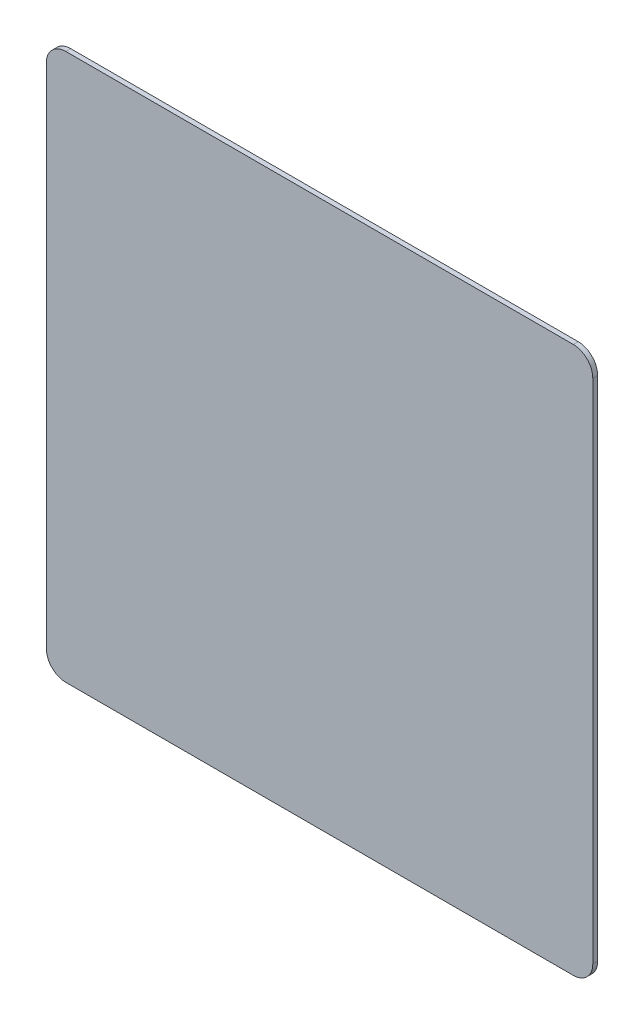
ISO-10303-21;
HEADER;
FILE_DESCRIPTION(('STEP AP214'),'2;1');
FILE_NAME('part.step','',(''),(''),'','','');
FILE_SCHEMA(('AUTOMOTIVE_DESIGN { 1 0 10303 214 1 1 1 1 }'));
ENDSEC;
DATA;
#1=APPLICATION_CONTEXT('core data for automotive mechanical design processes');
#2=APPLICATION_PROTOCOL_DEFINITION('international standard','automotive_design',2000,#1);
#3=PRODUCT_CONTEXT('',#1,'mechanical');
#4=PRODUCT('Part','Part','',(#3));
#5=PRODUCT_RELATED_PRODUCT_CATEGORY('part','',(#4));
#6=PRODUCT_DEFINITION_FORMATION('','',#4);
#7=PRODUCT_DEFINITION_CONTEXT('part definition',#1,'design');
#8=PRODUCT_DEFINITION('design','',#6,#7);
#9=PRODUCT_DEFINITION_SHAPE('','',#8);
#10=(LENGTH_UNIT() NAMED_UNIT(*) SI_UNIT(.MILLI.,.METRE.));
#11=(NAMED_UNIT(*) PLANE_ANGLE_UNIT() SI_UNIT($,.RADIAN.));
#12=(NAMED_UNIT(*) SI_UNIT($,.STERADIAN.) SOLID_ANGLE_UNIT());
#13=UNCERTAINTY_MEASURE_WITH_UNIT(LENGTH_MEASURE(1.E-05),#10,'distance_accuracy_value','');
#14=(GEOMETRIC_REPRESENTATION_CONTEXT(3) GLOBAL_UNCERTAINTY_ASSIGNED_CONTEXT((#13)) GLOBAL_UNIT_ASSIGNED_CONTEXT((#10,
#11,#12)) REPRESENTATION_CONTEXT('',''));
#15=CARTESIAN_POINT('',(0.,0.,0.));
#16=DIRECTION('',(0.,0.,1.));
#17=DIRECTION('',(1.,0.,0.));
#18=AXIS2_PLACEMENT_3D('',#15,#16,#17);
#19=CARTESIAN_POINT('',(-28.,28.,7.5));
#20=DIRECTION('',(1.,0.,0.));
#21=DIRECTION('',(0.,1.,0.));
#22=AXIS2_PLACEMENT_3D('',#19,#20,#21);
#23=PLANE('',#22);
#24=DIRECTION('',(0.,-1.,0.));
#25=VECTOR('',#24,1.);
#26=CARTESIAN_POINT('',(-28.,28.,7.5));
#27=LINE('',#26,#25);
#28=CARTESIAN_POINT('',(-28.,26.,7.5));
#29=VERTEX_POINT('',#28);
#30=CARTESIAN_POINT('',(-28.,-26.,7.5));
#31=VERTEX_POINT('',#30);
#32=EDGE_CURVE('E158',#29,#31,#27,.T.);
#33=ORIENTED_EDGE('',*,*,#32,.F.);
#34=DIRECTION('',(0.,0.,-1.));
#35=VECTOR('',#34,1.);
#36=CARTESIAN_POINT('',(-28.,26.,7.5));
#37=LINE('',#36,#35);
#38=CARTESIAN_POINT('',(-28.,26.,7.));
#39=VERTEX_POINT('',#38);
#40=EDGE_CURVE('E114',#29,#39,#37,.T.);
#41=ORIENTED_EDGE('',*,*,#40,.T.);
#42=DIRECTION('',(0.,-1.,0.));
#43=VECTOR('',#42,1.);
#44=CARTESIAN_POINT('',(-28.,28.,7.));
#45=LINE('',#44,#43);
#46=CARTESIAN_POINT('',(-28.,-26.,7.));
#47=VERTEX_POINT('',#46);
#48=EDGE_CURVE('E109',#39,#47,#45,.T.);
#49=ORIENTED_EDGE('',*,*,#48,.T.);
#50=DIRECTION('',(0.,0.,-1.));
#51=VECTOR('',#50,1.);
#52=CARTESIAN_POINT('',(-28.,-26.,7.5));
#53=LINE('',#52,#51);
#54=EDGE_CURVE('E119',#47,#31,#53,.F.);
#55=ORIENTED_EDGE('',*,*,#54,.T.);
#56=EDGE_LOOP('',(#33,#41,#49,#55));
#57=FACE_BOUND('',#56,.T.);
#58=ADVANCED_FACE('F33',(#57),#23,.F.);
#59=CARTESIAN_POINT('',(-28.,-28.,7.5));
#60=DIRECTION('',(0.,1.,0.));
#61=DIRECTION('',(-1.,0.,0.));
#62=AXIS2_PLACEMENT_3D('',#59,#60,#61);
#63=PLANE('',#62);
#64=DIRECTION('',(1.,0.,0.));
#65=VECTOR('',#64,1.);
#66=CARTESIAN_POINT('',(-28.,-28.,7.5));
#67=LINE('',#66,#65);
#68=CARTESIAN_POINT('',(-26.,-28.,7.5));
#69=VERTEX_POINT('',#68);
#70=CARTESIAN_POINT('',(26.,-28.,7.5));
#71=VERTEX_POINT('',#70);
#72=EDGE_CURVE('E156',#69,#71,#67,.T.);
#73=ORIENTED_EDGE('',*,*,#72,.F.);
#74=DIRECTION('',(0.,0.,-1.));
#75=VECTOR('',#74,1.);
#76=CARTESIAN_POINT('',(-26.,-28.,7.5));
#77=LINE('',#76,#75);
#78=CARTESIAN_POINT('',(-26.,-28.,7.));
#79=VERTEX_POINT('',#78);
#80=EDGE_CURVE('E108',#69,#79,#77,.T.);
#81=ORIENTED_EDGE('',*,*,#80,.T.);
#82=DIRECTION('',(1.,0.,0.));
#83=VECTOR('',#82,1.);
#84=CARTESIAN_POINT('',(-28.,-28.,7.));
#85=LINE('',#84,#83);
#86=CARTESIAN_POINT('',(26.,-28.,7.));
#87=VERTEX_POINT('',#86);
#88=EDGE_CURVE('E98',#79,#87,#85,.T.);
#89=ORIENTED_EDGE('',*,*,#88,.T.);
#90=DIRECTION('',(0.,0.,-1.));
#91=VECTOR('',#90,1.);
#92=CARTESIAN_POINT('',(26.,-28.,7.5));
#93=LINE('',#92,#91);
#94=EDGE_CURVE('E47',#87,#71,#93,.F.);
#95=ORIENTED_EDGE('',*,*,#94,.T.);
#96=EDGE_LOOP('',(#73,#81,#89,#95));
#97=FACE_BOUND('',#96,.T.);
#98=ADVANCED_FACE('F106',(#97),#63,.F.);
#99=CARTESIAN_POINT('',(28.,28.,7.5));
#100=DIRECTION('',(-1.,0.,0.));
#101=DIRECTION('',(0.,-1.,0.));
#102=AXIS2_PLACEMENT_3D('',#99,#100,#101);
#103=PLANE('',#102);
#104=DIRECTION('',(0.,1.,0.));
#105=VECTOR('',#104,1.);
#106=CARTESIAN_POINT('',(28.,28.,7.));
#107=LINE('',#106,#105);
#108=CARTESIAN_POINT('',(28.,-26.,7.));
#109=VERTEX_POINT('',#108);
#110=CARTESIAN_POINT('',(28.,26.,7.));
#111=VERTEX_POINT('',#110);
#112=EDGE_CURVE('E101',#109,#111,#107,.T.);
#113=ORIENTED_EDGE('',*,*,#112,.T.);
#114=DIRECTION('',(0.,0.,-1.));
#115=VECTOR('',#114,1.);
#116=CARTESIAN_POINT('',(28.,26.,7.5));
#117=LINE('',#116,#115);
#118=CARTESIAN_POINT('',(28.,26.,7.5));
#119=VERTEX_POINT('',#118);
#120=EDGE_CURVE('E141',#111,#119,#117,.F.);
#121=ORIENTED_EDGE('',*,*,#120,.T.);
#122=DIRECTION('',(0.,1.,0.));
#123=VECTOR('',#122,1.);
#124=CARTESIAN_POINT('',(28.,28.,7.5));
#125=LINE('',#124,#123);
#126=CARTESIAN_POINT('',(28.,-26.,7.5));
#127=VERTEX_POINT('',#126);
#128=EDGE_CURVE('E153',#127,#119,#125,.T.);
#129=ORIENTED_EDGE('',*,*,#128,.F.);
#130=DIRECTION('',(0.,0.,-1.));
#131=VECTOR('',#130,1.);
#132=CARTESIAN_POINT('',(28.,-26.,7.5));
#133=LINE('',#132,#131);
#134=EDGE_CURVE('E143',#127,#109,#133,.T.);
#135=ORIENTED_EDGE('',*,*,#134,.T.);
#136=EDGE_LOOP('',(#113,#121,#129,#135));
#137=FACE_BOUND('',#136,.T.);
#138=ADVANCED_FACE('F165',(#137),#103,.F.);
#139=CARTESIAN_POINT('',(-28.,28.,7.5));
#140=DIRECTION('',(0.,-1.,0.));
#141=DIRECTION('',(0.,0.,-1.));
#142=AXIS2_PLACEMENT_3D('',#139,#140,#141);
#143=PLANE('',#142);
#144=DIRECTION('',(-1.,0.,0.));
#145=VECTOR('',#144,1.);
#146=CARTESIAN_POINT('',(-28.,28.,7.5));
#147=LINE('',#146,#145);
#148=CARTESIAN_POINT('',(26.,28.,7.5));
#149=VERTEX_POINT('',#148);
#150=CARTESIAN_POINT('',(-26.,28.,7.5));
#151=VERTEX_POINT('',#150);
#152=EDGE_CURVE('E150',#149,#151,#147,.T.);
#153=ORIENTED_EDGE('',*,*,#152,.F.);
#154=DIRECTION('',(0.,0.,-1.));
#155=VECTOR('',#154,1.);
#156=CARTESIAN_POINT('',(26.,28.,7.5));
#157=LINE('',#156,#155);
#158=CARTESIAN_POINT('',(26.,28.,7.));
#159=VERTEX_POINT('',#158);
#160=EDGE_CURVE('E145',#149,#159,#157,.T.);
#161=ORIENTED_EDGE('',*,*,#160,.T.);
#162=DIRECTION('',(-1.,0.,0.));
#163=VECTOR('',#162,1.);
#164=CARTESIAN_POINT('',(-28.,28.,7.));
#165=LINE('',#164,#163);
#166=CARTESIAN_POINT('',(-26.,28.,7.));
#167=VERTEX_POINT('',#166);
#168=EDGE_CURVE('E160',#159,#167,#165,.T.);
#169=ORIENTED_EDGE('',*,*,#168,.T.);
#170=DIRECTION('',(0.,0.,-1.));
#171=VECTOR('',#170,1.);
#172=CARTESIAN_POINT('',(-26.,28.,7.5));
#173=LINE('',#172,#171);
#174=EDGE_CURVE('E148',#167,#151,#173,.F.);
#175=ORIENTED_EDGE('',*,*,#174,.T.);
#176=EDGE_LOOP('',(#153,#161,#169,#175));
#177=FACE_BOUND('',#176,.T.);
#178=ADVANCED_FACE('F176',(#177),#143,.F.);
#179=CARTESIAN_POINT('',(-28.,28.,7.5));
#180=DIRECTION('',(0.,0.,1.));
#181=DIRECTION('',(1.,0.,0.));
#182=AXIS2_PLACEMENT_3D('',#179,#180,#181);
#183=PLANE('',#182);
#184=ORIENTED_EDGE('',*,*,#128,.T.);
#185=CARTESIAN_POINT('',(26.,26.,7.5));
#186=DIRECTION('',(0.,0.,1.));
#187=DIRECTION('',(1.,0.,0.));
#188=AXIS2_PLACEMENT_3D('',#185,#186,#187);
#189=CIRCLE('',#188,2.);
#190=EDGE_CURVE('E134',#119,#149,#189,.T.);
#191=ORIENTED_EDGE('',*,*,#190,.T.);
#192=ORIENTED_EDGE('',*,*,#152,.T.);
#193=CARTESIAN_POINT('',(-26.,26.,7.5));
#194=DIRECTION('',(0.,0.,1.));
#195=DIRECTION('',(1.,0.,0.));
#196=AXIS2_PLACEMENT_3D('',#193,#194,#195);
#197=CIRCLE('',#196,2.);
#198=EDGE_CURVE('E135',#151,#29,#197,.T.);
#199=ORIENTED_EDGE('',*,*,#198,.T.);
#200=ORIENTED_EDGE('',*,*,#32,.T.);
#201=CARTESIAN_POINT('',(-26.,-26.,7.5));
#202=DIRECTION('',(0.,0.,1.));
#203=DIRECTION('',(1.,0.,0.));
#204=AXIS2_PLACEMENT_3D('',#201,#202,#203);
#205=CIRCLE('',#204,2.);
#206=EDGE_CURVE('E54',#31,#69,#205,.T.);
#207=ORIENTED_EDGE('',*,*,#206,.T.);
#208=ORIENTED_EDGE('',*,*,#72,.T.);
#209=CARTESIAN_POINT('',(26.,-26.,7.5));
#210=DIRECTION('',(0.,0.,1.));
#211=DIRECTION('',(1.,0.,0.));
#212=AXIS2_PLACEMENT_3D('',#209,#210,#211);
#213=CIRCLE('',#212,2.);
#214=EDGE_CURVE('E113',#71,#127,#213,.T.);
#215=ORIENTED_EDGE('',*,*,#214,.T.);
#216=EDGE_LOOP('',(#184,#191,#192,#199,#200,#207,#208,#215));
#217=FACE_BOUND('',#216,.T.);
#218=ADVANCED_FACE('F173',(#217),#183,.T.);
#219=CARTESIAN_POINT('',(26.,26.,7.5));
#220=DIRECTION('',(0.,0.,-1.));
#221=DIRECTION('',(-1.,0.,0.));
#222=AXIS2_PLACEMENT_3D('',#219,#220,#221);
#223=CYLINDRICAL_SURFACE('',#222,2.);
#224=ORIENTED_EDGE('',*,*,#190,.F.);
#225=ORIENTED_EDGE('',*,*,#120,.F.);
#226=CARTESIAN_POINT('',(26.,26.,7.));
#227=DIRECTION('',(0.,0.,1.));
#228=DIRECTION('',(1.,0.,0.));
#229=AXIS2_PLACEMENT_3D('',#226,#227,#228);
#230=CIRCLE('',#229,2.);
#231=EDGE_CURVE('E116',#159,#111,#230,.F.);
#232=ORIENTED_EDGE('',*,*,#231,.F.);
#233=ORIENTED_EDGE('',*,*,#160,.F.);
#234=EDGE_LOOP('',(#224,#225,#232,#233));
#235=FACE_BOUND('',#234,.T.);
#236=ADVANCED_FACE('F170',(#235),#223,.T.);
#237=CARTESIAN_POINT('',(-26.,26.,7.5));
#238=DIRECTION('',(0.,0.,-1.));
#239=DIRECTION('',(-1.,0.,0.));
#240=AXIS2_PLACEMENT_3D('',#237,#238,#239);
#241=CYLINDRICAL_SURFACE('',#240,2.);
#242=ORIENTED_EDGE('',*,*,#198,.F.);
#243=ORIENTED_EDGE('',*,*,#174,.F.);
#244=CARTESIAN_POINT('',(-26.,26.,7.));
#245=DIRECTION('',(0.,0.,1.));
#246=DIRECTION('',(1.,0.,0.));
#247=AXIS2_PLACEMENT_3D('',#244,#245,#246);
#248=CIRCLE('',#247,2.);
#249=EDGE_CURVE('E124',#39,#167,#248,.F.);
#250=ORIENTED_EDGE('',*,*,#249,.F.);
#251=ORIENTED_EDGE('',*,*,#40,.F.);
#252=EDGE_LOOP('',(#242,#243,#250,#251));
#253=FACE_BOUND('',#252,.T.);
#254=ADVANCED_FACE('F179',(#253),#241,.T.);
#255=CARTESIAN_POINT('',(-26.,-26.,7.5));
#256=DIRECTION('',(0.,0.,-1.));
#257=DIRECTION('',(-1.,0.,0.));
#258=AXIS2_PLACEMENT_3D('',#255,#256,#257);
#259=CYLINDRICAL_SURFACE('',#258,2.);
#260=ORIENTED_EDGE('',*,*,#206,.F.);
#261=ORIENTED_EDGE('',*,*,#54,.F.);
#262=CARTESIAN_POINT('',(-26.,-26.,7.));
#263=DIRECTION('',(0.,0.,1.));
#264=DIRECTION('',(1.,0.,0.));
#265=AXIS2_PLACEMENT_3D('',#262,#263,#264);
#266=CIRCLE('',#265,2.);
#267=EDGE_CURVE('E40',#79,#47,#266,.F.);
#268=ORIENTED_EDGE('',*,*,#267,.F.);
#269=ORIENTED_EDGE('',*,*,#80,.F.);
#270=EDGE_LOOP('',(#260,#261,#268,#269));
#271=FACE_BOUND('',#270,.T.);
#272=ADVANCED_FACE('F133',(#271),#259,.T.);
#273=CARTESIAN_POINT('',(26.,-26.,7.5));
#274=DIRECTION('',(0.,0.,-1.));
#275=DIRECTION('',(-1.,0.,0.));
#276=AXIS2_PLACEMENT_3D('',#273,#274,#275);
#277=CYLINDRICAL_SURFACE('',#276,2.);
#278=ORIENTED_EDGE('',*,*,#214,.F.);
#279=ORIENTED_EDGE('',*,*,#94,.F.);
#280=CARTESIAN_POINT('',(26.,-26.,7.));
#281=DIRECTION('',(0.,0.,1.));
#282=DIRECTION('',(1.,0.,0.));
#283=AXIS2_PLACEMENT_3D('',#280,#281,#282);
#284=CIRCLE('',#283,2.);
#285=EDGE_CURVE('E11',#109,#87,#284,.F.);
#286=ORIENTED_EDGE('',*,*,#285,.F.);
#287=ORIENTED_EDGE('',*,*,#134,.F.);
#288=EDGE_LOOP('',(#278,#279,#286,#287));
#289=FACE_BOUND('',#288,.T.);
#290=ADVANCED_FACE('F112',(#289),#277,.T.);
#291=CARTESIAN_POINT('',(30.,30.,7.));
#292=DIRECTION('',(0.,0.,1.));
#293=DIRECTION('',(1.,0.,0.));
#294=AXIS2_PLACEMENT_3D('',#291,#292,#293);
#295=PLANE('',#294);
#296=ORIENTED_EDGE('',*,*,#249,.T.);
#297=ORIENTED_EDGE('',*,*,#168,.F.);
#298=ORIENTED_EDGE('',*,*,#231,.T.);
#299=ORIENTED_EDGE('',*,*,#112,.F.);
#300=ORIENTED_EDGE('',*,*,#285,.T.);
#301=ORIENTED_EDGE('',*,*,#88,.F.);
#302=ORIENTED_EDGE('',*,*,#267,.T.);
#303=ORIENTED_EDGE('',*,*,#48,.F.);
#304=EDGE_LOOP('',(#296,#297,#298,#299,#300,#301,#302,#303));
#305=FACE_BOUND('',#304,.T.);
#306=ADVANCED_FACE('F97',(#305),#295,.F.);
#307=CLOSED_SHELL('',(#58,#98,#138,#178,#218,#236,#254,#272,#290,#306));
#308=MANIFOLD_SOLID_BREP('B2',#307);
#309=ADVANCED_BREP_SHAPE_REPRESENTATION('',(#18,#308),#14);
#310=SHAPE_DEFINITION_REPRESENTATION(#9,#309);
ENDSEC;
END-ISO-10303-21;
